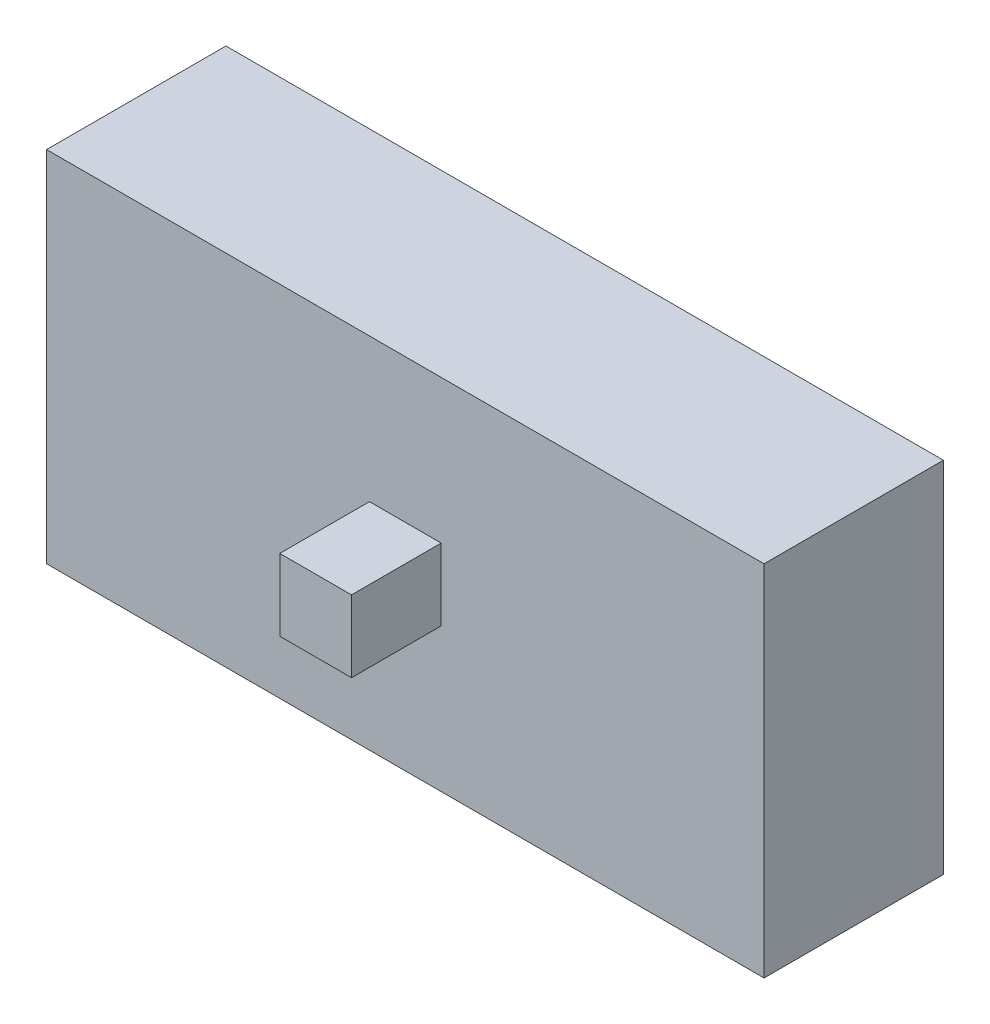
ISO-10303-21;
HEADER;
FILE_DESCRIPTION(('STEP AP214'),'2;1');
FILE_NAME('part.step','',(''),(''),'','','');
FILE_SCHEMA(('AUTOMOTIVE_DESIGN { 1 0 10303 214 1 1 1 1 }'));
ENDSEC;
DATA;
#1=APPLICATION_CONTEXT('core data for automotive mechanical design processes');
#2=APPLICATION_PROTOCOL_DEFINITION('international standard','automotive_design',2000,#1);
#3=PRODUCT_CONTEXT('',#1,'mechanical');
#4=PRODUCT('Part','Part','',(#3));
#5=PRODUCT_RELATED_PRODUCT_CATEGORY('part','',(#4));
#6=PRODUCT_DEFINITION_FORMATION('','',#4);
#7=PRODUCT_DEFINITION_CONTEXT('part definition',#1,'design');
#8=PRODUCT_DEFINITION('design','',#6,#7);
#9=PRODUCT_DEFINITION_SHAPE('','',#8);
#10=(LENGTH_UNIT() NAMED_UNIT(*) SI_UNIT(.MILLI.,.METRE.));
#11=(NAMED_UNIT(*) PLANE_ANGLE_UNIT() SI_UNIT($,.RADIAN.));
#12=(NAMED_UNIT(*) SI_UNIT($,.STERADIAN.) SOLID_ANGLE_UNIT());
#13=UNCERTAINTY_MEASURE_WITH_UNIT(LENGTH_MEASURE(1.E-05),#10,'distance_accuracy_value','');
#14=(GEOMETRIC_REPRESENTATION_CONTEXT(3) GLOBAL_UNCERTAINTY_ASSIGNED_CONTEXT((#13)) GLOBAL_UNIT_ASSIGNED_CONTEXT((#10,
#11,#12)) REPRESENTATION_CONTEXT('',''));
#15=CARTESIAN_POINT('',(0.,0.,0.));
#16=DIRECTION('',(0.,0.,1.));
#17=DIRECTION('',(1.,0.,0.));
#18=AXIS2_PLACEMENT_3D('',#15,#16,#17);
#19=CARTESIAN_POINT('',(0.,0.,10.));
#20=DIRECTION('',(0.,0.,1.));
#21=DIRECTION('',(1.,0.,0.));
#22=AXIS2_PLACEMENT_3D('',#19,#20,#21);
#23=PLANE('',#22);
#24=DIRECTION('',(0.,-1.,0.));
#25=VECTOR('',#24,1.);
#26=CARTESIAN_POINT('',(0.,20.,10.));
#27=LINE('',#26,#25);
#28=CARTESIAN_POINT('',(0.,20.,10.));
#29=VERTEX_POINT('',#28);
#30=CARTESIAN_POINT('',(0.,0.,10.));
#31=VERTEX_POINT('',#30);
#32=EDGE_CURVE('E148',#29,#31,#27,.T.);
#33=ORIENTED_EDGE('',*,*,#32,.T.);
#34=DIRECTION('',(1.,0.,0.));
#35=VECTOR('',#34,1.);
#36=CARTESIAN_POINT('',(0.,0.,10.));
#37=LINE('',#36,#35);
#38=CARTESIAN_POINT('',(40.,0.,10.));
#39=VERTEX_POINT('',#38);
#40=EDGE_CURVE('E93',#31,#39,#37,.T.);
#41=ORIENTED_EDGE('',*,*,#40,.T.);
#42=DIRECTION('',(0.,1.,0.));
#43=VECTOR('',#42,1.);
#44=CARTESIAN_POINT('',(40.,0.,10.));
#45=LINE('',#44,#43);
#46=CARTESIAN_POINT('',(40.,20.,10.));
#47=VERTEX_POINT('',#46);
#48=EDGE_CURVE('E151',#39,#47,#45,.T.);
#49=ORIENTED_EDGE('',*,*,#48,.T.);
#50=DIRECTION('',(-1.,0.,0.));
#51=VECTOR('',#50,1.);
#52=CARTESIAN_POINT('',(40.,20.,10.));
#53=LINE('',#52,#51);
#54=EDGE_CURVE('E65',#47,#29,#53,.T.);
#55=ORIENTED_EDGE('',*,*,#54,.T.);
#56=EDGE_LOOP('',(#33,#41,#49,#55));
#57=FACE_BOUND('',#56,.T.);
#58=DIRECTION('',(1.,0.,0.));
#59=VECTOR('',#58,1.);
#60=CARTESIAN_POINT('',(18.,8.,10.));
#61=LINE('',#60,#59);
#62=CARTESIAN_POINT('',(18.,8.,10.));
#63=VERTEX_POINT('',#62);
#64=CARTESIAN_POINT('',(22.,8.,10.));
#65=VERTEX_POINT('',#64);
#66=EDGE_CURVE('E271',#63,#65,#61,.T.);
#67=ORIENTED_EDGE('',*,*,#66,.F.);
#68=DIRECTION('',(0.,-1.,0.));
#69=VECTOR('',#68,1.);
#70=CARTESIAN_POINT('',(18.,12.,10.));
#71=LINE('',#70,#69);
#72=CARTESIAN_POINT('',(18.,12.,10.));
#73=VERTEX_POINT('',#72);
#74=EDGE_CURVE('E138',#73,#63,#71,.T.);
#75=ORIENTED_EDGE('',*,*,#74,.F.);
#76=DIRECTION('',(-1.,0.,0.));
#77=VECTOR('',#76,1.);
#78=CARTESIAN_POINT('',(22.,12.,10.));
#79=LINE('',#78,#77);
#80=CARTESIAN_POINT('',(22.,12.,10.));
#81=VERTEX_POINT('',#80);
#82=EDGE_CURVE('E134',#81,#73,#79,.T.);
#83=ORIENTED_EDGE('',*,*,#82,.F.);
#84=DIRECTION('',(0.,1.,0.));
#85=VECTOR('',#84,1.);
#86=CARTESIAN_POINT('',(22.,8.,10.));
#87=LINE('',#86,#85);
#88=EDGE_CURVE('E268',#65,#81,#87,.T.);
#89=ORIENTED_EDGE('',*,*,#88,.F.);
#90=EDGE_LOOP('',(#67,#75,#83,#89));
#91=FACE_BOUND('',#90,.T.);
#92=ADVANCED_FACE('F41',(#57,#91),#23,.T.);
#93=CARTESIAN_POINT('',(0.,20.,10.));
#94=DIRECTION('',(1.,0.,0.));
#95=DIRECTION('',(0.,0.,-1.));
#96=AXIS2_PLACEMENT_3D('',#93,#94,#95);
#97=PLANE('',#96);
#98=DIRECTION('',(0.,-1.,0.));
#99=VECTOR('',#98,1.);
#100=CARTESIAN_POINT('',(0.,20.,0.));
#101=LINE('',#100,#99);
#102=CARTESIAN_POINT('',(0.,20.,0.));
#103=VERTEX_POINT('',#102);
#104=CARTESIAN_POINT('',(0.,0.,0.));
#105=VERTEX_POINT('',#104);
#106=EDGE_CURVE('E140',#103,#105,#101,.T.);
#107=ORIENTED_EDGE('',*,*,#106,.T.);
#108=DIRECTION('',(0.,0.,-1.));
#109=VECTOR('',#108,1.);
#110=CARTESIAN_POINT('',(0.,0.,10.));
#111=LINE('',#110,#109);
#112=EDGE_CURVE('E11',#31,#105,#111,.T.);
#113=ORIENTED_EDGE('',*,*,#112,.F.);
#114=ORIENTED_EDGE('',*,*,#32,.F.);
#115=DIRECTION('',(0.,0.,-1.));
#116=VECTOR('',#115,1.);
#117=CARTESIAN_POINT('',(0.,20.,10.));
#118=LINE('',#117,#116);
#119=EDGE_CURVE('E153',#29,#103,#118,.T.);
#120=ORIENTED_EDGE('',*,*,#119,.T.);
#121=EDGE_LOOP('',(#107,#113,#114,#120));
#122=FACE_BOUND('',#121,.T.);
#123=ADVANCED_FACE('F43',(#122),#97,.F.);
#124=CARTESIAN_POINT('',(0.,0.,10.));
#125=DIRECTION('',(0.,1.,0.));
#126=DIRECTION('',(0.,0.,1.));
#127=AXIS2_PLACEMENT_3D('',#124,#125,#126);
#128=PLANE('',#127);
#129=DIRECTION('',(1.,0.,0.));
#130=VECTOR('',#129,1.);
#131=CARTESIAN_POINT('',(0.,0.,0.));
#132=LINE('',#131,#130);
#133=CARTESIAN_POINT('',(40.,0.,0.));
#134=VERTEX_POINT('',#133);
#135=EDGE_CURVE('E143',#105,#134,#132,.T.);
#136=ORIENTED_EDGE('',*,*,#135,.T.);
#137=DIRECTION('',(0.,0.,-1.));
#138=VECTOR('',#137,1.);
#139=CARTESIAN_POINT('',(40.,0.,10.));
#140=LINE('',#139,#138);
#141=EDGE_CURVE('E49',#39,#134,#140,.T.);
#142=ORIENTED_EDGE('',*,*,#141,.F.);
#143=ORIENTED_EDGE('',*,*,#40,.F.);
#144=ORIENTED_EDGE('',*,*,#112,.T.);
#145=EDGE_LOOP('',(#136,#142,#143,#144));
#146=FACE_BOUND('',#145,.T.);
#147=ADVANCED_FACE('F181',(#146),#128,.F.);
#148=CARTESIAN_POINT('',(40.,0.,10.));
#149=DIRECTION('',(-1.,0.,0.));
#150=DIRECTION('',(0.,0.,1.));
#151=AXIS2_PLACEMENT_3D('',#148,#149,#150);
#152=PLANE('',#151);
#153=DIRECTION('',(0.,1.,0.));
#154=VECTOR('',#153,1.);
#155=CARTESIAN_POINT('',(40.,0.,0.));
#156=LINE('',#155,#154);
#157=CARTESIAN_POINT('',(40.,20.,0.));
#158=VERTEX_POINT('',#157);
#159=EDGE_CURVE('E156',#134,#158,#156,.T.);
#160=ORIENTED_EDGE('',*,*,#159,.T.);
#161=DIRECTION('',(0.,0.,-1.));
#162=VECTOR('',#161,1.);
#163=CARTESIAN_POINT('',(40.,20.,10.));
#164=LINE('',#163,#162);
#165=EDGE_CURVE('E160',#47,#158,#164,.T.);
#166=ORIENTED_EDGE('',*,*,#165,.F.);
#167=ORIENTED_EDGE('',*,*,#48,.F.);
#168=ORIENTED_EDGE('',*,*,#141,.T.);
#169=EDGE_LOOP('',(#160,#166,#167,#168));
#170=FACE_BOUND('',#169,.T.);
#171=ADVANCED_FACE('F165',(#170),#152,.F.);
#172=CARTESIAN_POINT('',(40.,20.,10.));
#173=DIRECTION('',(0.,-1.,0.));
#174=DIRECTION('',(0.,0.,-1.));
#175=AXIS2_PLACEMENT_3D('',#172,#173,#174);
#176=PLANE('',#175);
#177=DIRECTION('',(-1.,0.,0.));
#178=VECTOR('',#177,1.);
#179=CARTESIAN_POINT('',(40.,20.,0.));
#180=LINE('',#179,#178);
#181=EDGE_CURVE('E86',#158,#103,#180,.T.);
#182=ORIENTED_EDGE('',*,*,#181,.T.);
#183=ORIENTED_EDGE('',*,*,#119,.F.);
#184=ORIENTED_EDGE('',*,*,#54,.F.);
#185=ORIENTED_EDGE('',*,*,#165,.T.);
#186=EDGE_LOOP('',(#182,#183,#184,#185));
#187=FACE_BOUND('',#186,.T.);
#188=ADVANCED_FACE('F173',(#187),#176,.F.);
#189=CARTESIAN_POINT('',(0.,0.,0.));
#190=DIRECTION('',(0.,0.,1.));
#191=DIRECTION('',(1.,0.,0.));
#192=AXIS2_PLACEMENT_3D('',#189,#190,#191);
#193=PLANE('',#192);
#194=ORIENTED_EDGE('',*,*,#106,.F.);
#195=ORIENTED_EDGE('',*,*,#181,.F.);
#196=ORIENTED_EDGE('',*,*,#159,.F.);
#197=ORIENTED_EDGE('',*,*,#135,.F.);
#198=EDGE_LOOP('',(#194,#195,#196,#197));
#199=FACE_BOUND('',#198,.T.);
#200=ADVANCED_FACE('F169',(#199),#193,.F.);
#201=CARTESIAN_POINT('',(18.,12.,15.));
#202=DIRECTION('',(1.,0.,0.));
#203=DIRECTION('',(0.,0.,-1.));
#204=AXIS2_PLACEMENT_3D('',#201,#202,#203);
#205=PLANE('',#204);
#206=ORIENTED_EDGE('',*,*,#74,.T.);
#207=DIRECTION('',(0.,0.,-1.));
#208=VECTOR('',#207,1.);
#209=CARTESIAN_POINT('',(18.,8.,15.));
#210=LINE('',#209,#208);
#211=CARTESIAN_POINT('',(18.,8.,15.));
#212=VERTEX_POINT('',#211);
#213=EDGE_CURVE('E119',#212,#63,#210,.T.);
#214=ORIENTED_EDGE('',*,*,#213,.F.);
#215=DIRECTION('',(0.,-1.,0.));
#216=VECTOR('',#215,1.);
#217=CARTESIAN_POINT('',(18.,12.,15.));
#218=LINE('',#217,#216);
#219=CARTESIAN_POINT('',(18.,12.,15.));
#220=VERTEX_POINT('',#219);
#221=EDGE_CURVE('E126',#220,#212,#218,.T.);
#222=ORIENTED_EDGE('',*,*,#221,.F.);
#223=DIRECTION('',(0.,0.,-1.));
#224=VECTOR('',#223,1.);
#225=CARTESIAN_POINT('',(18.,12.,15.));
#226=LINE('',#225,#224);
#227=EDGE_CURVE('E266',#220,#73,#226,.T.);
#228=ORIENTED_EDGE('',*,*,#227,.T.);
#229=EDGE_LOOP('',(#206,#214,#222,#228));
#230=FACE_BOUND('',#229,.T.);
#231=ADVANCED_FACE('F136',(#230),#205,.F.);
#232=CARTESIAN_POINT('',(18.,8.,15.));
#233=DIRECTION('',(0.,1.,0.));
#234=DIRECTION('',(0.,0.,1.));
#235=AXIS2_PLACEMENT_3D('',#232,#233,#234);
#236=PLANE('',#235);
#237=ORIENTED_EDGE('',*,*,#66,.T.);
#238=DIRECTION('',(0.,0.,-1.));
#239=VECTOR('',#238,1.);
#240=CARTESIAN_POINT('',(22.,8.,15.));
#241=LINE('',#240,#239);
#242=CARTESIAN_POINT('',(22.,8.,15.));
#243=VERTEX_POINT('',#242);
#244=EDGE_CURVE('E122',#243,#65,#241,.T.);
#245=ORIENTED_EDGE('',*,*,#244,.F.);
#246=DIRECTION('',(1.,0.,0.));
#247=VECTOR('',#246,1.);
#248=CARTESIAN_POINT('',(18.,8.,15.));
#249=LINE('',#248,#247);
#250=EDGE_CURVE('E115',#212,#243,#249,.T.);
#251=ORIENTED_EDGE('',*,*,#250,.F.);
#252=ORIENTED_EDGE('',*,*,#213,.T.);
#253=EDGE_LOOP('',(#237,#245,#251,#252));
#254=FACE_BOUND('',#253,.T.);
#255=ADVANCED_FACE('F117',(#254),#236,.F.);
#256=CARTESIAN_POINT('',(22.,8.,15.));
#257=DIRECTION('',(-1.,0.,0.));
#258=DIRECTION('',(0.,0.,1.));
#259=AXIS2_PLACEMENT_3D('',#256,#257,#258);
#260=PLANE('',#259);
#261=ORIENTED_EDGE('',*,*,#88,.T.);
#262=DIRECTION('',(0.,0.,-1.));
#263=VECTOR('',#262,1.);
#264=CARTESIAN_POINT('',(22.,12.,15.));
#265=LINE('',#264,#263);
#266=CARTESIAN_POINT('',(22.,12.,15.));
#267=VERTEX_POINT('',#266);
#268=EDGE_CURVE('E56',#267,#81,#265,.T.);
#269=ORIENTED_EDGE('',*,*,#268,.F.);
#270=DIRECTION('',(0.,1.,0.));
#271=VECTOR('',#270,1.);
#272=CARTESIAN_POINT('',(22.,8.,15.));
#273=LINE('',#272,#271);
#274=EDGE_CURVE('E125',#243,#267,#273,.T.);
#275=ORIENTED_EDGE('',*,*,#274,.F.);
#276=ORIENTED_EDGE('',*,*,#244,.T.);
#277=EDGE_LOOP('',(#261,#269,#275,#276));
#278=FACE_BOUND('',#277,.T.);
#279=ADVANCED_FACE('F194',(#278),#260,.F.);
#280=CARTESIAN_POINT('',(22.,12.,15.));
#281=DIRECTION('',(0.,-1.,0.));
#282=DIRECTION('',(0.,0.,-1.));
#283=AXIS2_PLACEMENT_3D('',#280,#281,#282);
#284=PLANE('',#283);
#285=ORIENTED_EDGE('',*,*,#82,.T.);
#286=ORIENTED_EDGE('',*,*,#227,.F.);
#287=DIRECTION('',(-1.,0.,0.));
#288=VECTOR('',#287,1.);
#289=CARTESIAN_POINT('',(22.,12.,15.));
#290=LINE('',#289,#288);
#291=EDGE_CURVE('E130',#267,#220,#290,.T.);
#292=ORIENTED_EDGE('',*,*,#291,.F.);
#293=ORIENTED_EDGE('',*,*,#268,.T.);
#294=EDGE_LOOP('',(#285,#286,#292,#293));
#295=FACE_BOUND('',#294,.T.);
#296=ADVANCED_FACE('F197',(#295),#284,.F.);
#297=CARTESIAN_POINT('',(0.,0.,15.));
#298=DIRECTION('',(0.,0.,1.));
#299=DIRECTION('',(1.,0.,0.));
#300=AXIS2_PLACEMENT_3D('',#297,#298,#299);
#301=PLANE('',#300);
#302=ORIENTED_EDGE('',*,*,#221,.T.);
#303=ORIENTED_EDGE('',*,*,#250,.T.);
#304=ORIENTED_EDGE('',*,*,#274,.T.);
#305=ORIENTED_EDGE('',*,*,#291,.T.);
#306=EDGE_LOOP('',(#302,#303,#304,#305));
#307=FACE_BOUND('',#306,.T.);
#308=ADVANCED_FACE('F129',(#307),#301,.T.);
#309=CLOSED_SHELL('',(#92,#123,#147,#171,#188,#200,#231,#255,#279,#296,#308));
#310=MANIFOLD_SOLID_BREP('B2',#309);
#311=ADVANCED_BREP_SHAPE_REPRESENTATION('',(#18,#310),#14);
#312=SHAPE_DEFINITION_REPRESENTATION(#9,#311);
ENDSEC;
END-ISO-10303-21;
